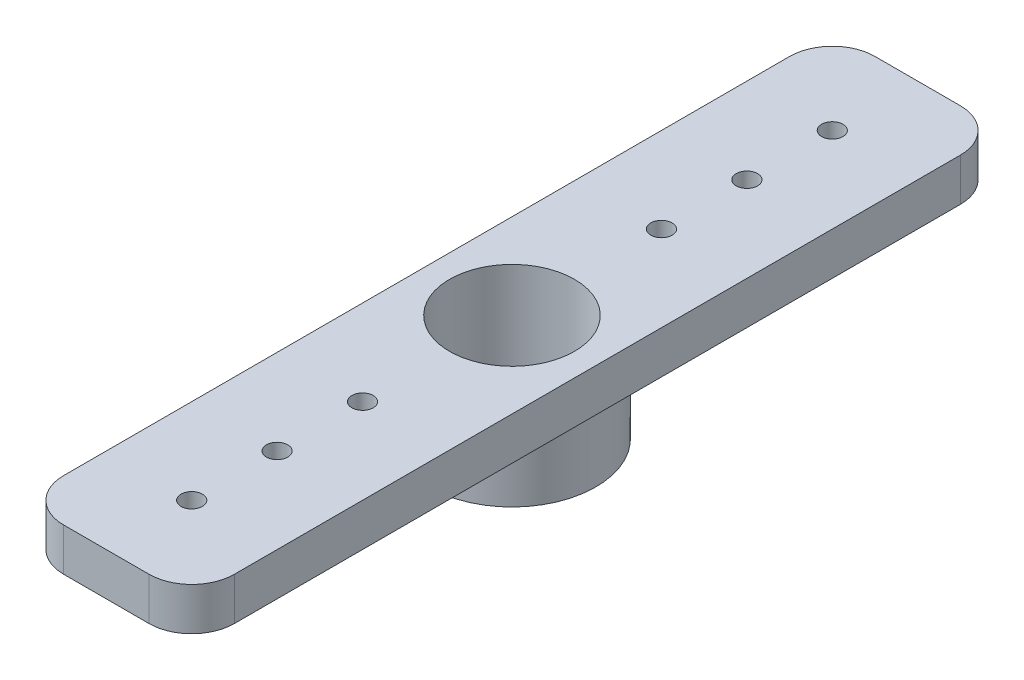
ISO-10303-21;
HEADER;
FILE_DESCRIPTION(('STEP AP214'),'2;1');
FILE_NAME('part.step','',(''),(''),'','','');
FILE_SCHEMA(('AUTOMOTIVE_DESIGN { 1 0 10303 214 1 1 1 1 }'));
ENDSEC;
DATA;
#1=APPLICATION_CONTEXT('core data for automotive mechanical design processes');
#2=APPLICATION_PROTOCOL_DEFINITION('international standard','automotive_design',2000,#1);
#3=PRODUCT_CONTEXT('',#1,'mechanical');
#4=PRODUCT('Part','Part','',(#3));
#5=PRODUCT_RELATED_PRODUCT_CATEGORY('part','',(#4));
#6=PRODUCT_DEFINITION_FORMATION('','',#4);
#7=PRODUCT_DEFINITION_CONTEXT('part definition',#1,'design');
#8=PRODUCT_DEFINITION('design','',#6,#7);
#9=PRODUCT_DEFINITION_SHAPE('','',#8);
#10=(LENGTH_UNIT() NAMED_UNIT(*) SI_UNIT(.MILLI.,.METRE.));
#11=(NAMED_UNIT(*) PLANE_ANGLE_UNIT() SI_UNIT($,.RADIAN.));
#12=(NAMED_UNIT(*) SI_UNIT($,.STERADIAN.) SOLID_ANGLE_UNIT());
#13=UNCERTAINTY_MEASURE_WITH_UNIT(LENGTH_MEASURE(1.E-05),#10,'distance_accuracy_value','');
#14=(GEOMETRIC_REPRESENTATION_CONTEXT(3) GLOBAL_UNCERTAINTY_ASSIGNED_CONTEXT((#13)) GLOBAL_UNIT_ASSIGNED_CONTEXT((#10,
#11,#12)) REPRESENTATION_CONTEXT('',''));
#15=CARTESIAN_POINT('',(0.,0.,0.));
#16=DIRECTION('',(0.,0.,1.));
#17=DIRECTION('',(1.,0.,0.));
#18=AXIS2_PLACEMENT_3D('',#15,#16,#17);
#19=CARTESIAN_POINT('',(0.,2.,0.));
#20=DIRECTION('',(1.,0.,0.));
#21=DIRECTION('',(0.,0.,-1.));
#22=AXIS2_PLACEMENT_3D('',#19,#20,#21);
#23=PLANE('',#22);
#24=DIRECTION('',(0.,0.,1.));
#25=VECTOR('',#24,1.);
#26=CARTESIAN_POINT('',(0.,2.,0.));
#27=LINE('',#26,#25);
#28=CARTESIAN_POINT('',(0.,2.,-36.));
#29=VERTEX_POINT('',#28);
#30=CARTESIAN_POINT('',(0.,2.,-2.));
#31=VERTEX_POINT('',#30);
#32=EDGE_CURVE('E125',#29,#31,#27,.T.);
#33=ORIENTED_EDGE('',*,*,#32,.F.);
#34=DIRECTION('',(0.,-1.,0.));
#35=VECTOR('',#34,1.);
#36=CARTESIAN_POINT('',(0.,2.,-36.));
#37=LINE('',#36,#35);
#38=CARTESIAN_POINT('',(0.,0.,-36.));
#39=VERTEX_POINT('',#38);
#40=EDGE_CURVE('E156',#29,#39,#37,.T.);
#41=ORIENTED_EDGE('',*,*,#40,.T.);
#42=DIRECTION('',(0.,0.,1.));
#43=VECTOR('',#42,1.);
#44=CARTESIAN_POINT('',(0.,0.,0.));
#45=LINE('',#44,#43);
#46=CARTESIAN_POINT('',(0.,0.,-2.));
#47=VERTEX_POINT('',#46);
#48=EDGE_CURVE('E162',#39,#47,#45,.T.);
#49=ORIENTED_EDGE('',*,*,#48,.T.);
#50=DIRECTION('',(0.,-1.,0.));
#51=VECTOR('',#50,1.);
#52=CARTESIAN_POINT('',(0.,2.,-2.));
#53=LINE('',#52,#51);
#54=EDGE_CURVE('E154',#47,#31,#53,.F.);
#55=ORIENTED_EDGE('',*,*,#54,.T.);
#56=EDGE_LOOP('',(#33,#41,#49,#55));
#57=FACE_BOUND('',#56,.T.);
#58=ADVANCED_FACE('F33',(#57),#23,.F.);
#59=CARTESIAN_POINT('',(0.,2.,0.));
#60=DIRECTION('',(0.,0.,-1.));
#61=DIRECTION('',(-1.,0.,0.));
#62=AXIS2_PLACEMENT_3D('',#59,#60,#61);
#63=PLANE('',#62);
#64=DIRECTION('',(1.,0.,0.));
#65=VECTOR('',#64,1.);
#66=CARTESIAN_POINT('',(0.,2.,0.));
#67=LINE('',#66,#65);
#68=CARTESIAN_POINT('',(2.,2.,0.));
#69=VERTEX_POINT('',#68);
#70=CARTESIAN_POINT('',(6.,2.,0.));
#71=VERTEX_POINT('',#70);
#72=EDGE_CURVE('E128',#69,#71,#67,.T.);
#73=ORIENTED_EDGE('',*,*,#72,.F.);
#74=DIRECTION('',(0.,-1.,0.));
#75=VECTOR('',#74,1.);
#76=CARTESIAN_POINT('',(2.,2.,0.));
#77=LINE('',#76,#75);
#78=CARTESIAN_POINT('',(2.,0.,0.));
#79=VERTEX_POINT('',#78);
#80=EDGE_CURVE('E11',#69,#79,#77,.T.);
#81=ORIENTED_EDGE('',*,*,#80,.T.);
#82=DIRECTION('',(1.,0.,0.));
#83=VECTOR('',#82,1.);
#84=CARTESIAN_POINT('',(0.,0.,0.));
#85=LINE('',#84,#83);
#86=CARTESIAN_POINT('',(6.,0.,0.));
#87=VERTEX_POINT('',#86);
#88=EDGE_CURVE('E130',#79,#87,#85,.T.);
#89=ORIENTED_EDGE('',*,*,#88,.T.);
#90=DIRECTION('',(0.,-1.,0.));
#91=VECTOR('',#90,1.);
#92=CARTESIAN_POINT('',(6.,2.,0.));
#93=LINE('',#92,#91);
#94=EDGE_CURVE('E41',#87,#71,#93,.F.);
#95=ORIENTED_EDGE('',*,*,#94,.T.);
#96=EDGE_LOOP('',(#73,#81,#89,#95));
#97=FACE_BOUND('',#96,.T.);
#98=ADVANCED_FACE('F245',(#97),#63,.F.);
#99=CARTESIAN_POINT('',(8.,2.,0.));
#100=DIRECTION('',(-1.,0.,0.));
#101=DIRECTION('',(0.,0.,1.));
#102=AXIS2_PLACEMENT_3D('',#99,#100,#101);
#103=PLANE('',#102);
#104=DIRECTION('',(0.,0.,-1.));
#105=VECTOR('',#104,1.);
#106=CARTESIAN_POINT('',(8.,0.,0.));
#107=LINE('',#106,#105);
#108=CARTESIAN_POINT('',(8.,0.,-2.));
#109=VERTEX_POINT('',#108);
#110=CARTESIAN_POINT('',(8.,0.,-36.));
#111=VERTEX_POINT('',#110);
#112=EDGE_CURVE('E126',#109,#111,#107,.T.);
#113=ORIENTED_EDGE('',*,*,#112,.T.);
#114=DIRECTION('',(0.,-1.,0.));
#115=VECTOR('',#114,1.);
#116=CARTESIAN_POINT('',(8.,2.,-36.));
#117=LINE('',#116,#115);
#118=CARTESIAN_POINT('',(8.,2.,-36.));
#119=VERTEX_POINT('',#118);
#120=EDGE_CURVE('E104',#111,#119,#117,.F.);
#121=ORIENTED_EDGE('',*,*,#120,.T.);
#122=DIRECTION('',(0.,0.,-1.));
#123=VECTOR('',#122,1.);
#124=CARTESIAN_POINT('',(8.,2.,0.));
#125=LINE('',#124,#123);
#126=CARTESIAN_POINT('',(8.,2.,-2.));
#127=VERTEX_POINT('',#126);
#128=EDGE_CURVE('E174',#127,#119,#125,.T.);
#129=ORIENTED_EDGE('',*,*,#128,.F.);
#130=DIRECTION('',(0.,-1.,0.));
#131=VECTOR('',#130,1.);
#132=CARTESIAN_POINT('',(8.,2.,-2.));
#133=LINE('',#132,#131);
#134=EDGE_CURVE('E109',#127,#109,#133,.T.);
#135=ORIENTED_EDGE('',*,*,#134,.T.);
#136=EDGE_LOOP('',(#113,#121,#129,#135));
#137=FACE_BOUND('',#136,.T.);
#138=ADVANCED_FACE('F250',(#137),#103,.F.);
#139=CARTESIAN_POINT('',(0.,2.,-38.));
#140=DIRECTION('',(0.,0.,1.));
#141=DIRECTION('',(1.,0.,0.));
#142=AXIS2_PLACEMENT_3D('',#139,#140,#141);
#143=PLANE('',#142);
#144=DIRECTION('',(-1.,0.,0.));
#145=VECTOR('',#144,1.);
#146=CARTESIAN_POINT('',(0.,2.,-38.));
#147=LINE('',#146,#145);
#148=CARTESIAN_POINT('',(6.,2.,-38.));
#149=VERTEX_POINT('',#148);
#150=CARTESIAN_POINT('',(2.,2.,-38.));
#151=VERTEX_POINT('',#150);
#152=EDGE_CURVE('E119',#149,#151,#147,.T.);
#153=ORIENTED_EDGE('',*,*,#152,.F.);
#154=DIRECTION('',(0.,-1.,0.));
#155=VECTOR('',#154,1.);
#156=CARTESIAN_POINT('',(6.,2.,-38.));
#157=LINE('',#156,#155);
#158=CARTESIAN_POINT('',(6.,0.,-38.));
#159=VERTEX_POINT('',#158);
#160=EDGE_CURVE('E103',#149,#159,#157,.T.);
#161=ORIENTED_EDGE('',*,*,#160,.T.);
#162=DIRECTION('',(-1.,0.,0.));
#163=VECTOR('',#162,1.);
#164=CARTESIAN_POINT('',(0.,0.,-38.));
#165=LINE('',#164,#163);
#166=CARTESIAN_POINT('',(2.,0.,-38.));
#167=VERTEX_POINT('',#166);
#168=EDGE_CURVE('E116',#159,#167,#165,.T.);
#169=ORIENTED_EDGE('',*,*,#168,.T.);
#170=DIRECTION('',(0.,-1.,0.));
#171=VECTOR('',#170,1.);
#172=CARTESIAN_POINT('',(2.,2.,-38.));
#173=LINE('',#172,#171);
#174=EDGE_CURVE('E121',#167,#151,#173,.F.);
#175=ORIENTED_EDGE('',*,*,#174,.T.);
#176=EDGE_LOOP('',(#153,#161,#169,#175));
#177=FACE_BOUND('',#176,.T.);
#178=ADVANCED_FACE('F115',(#177),#143,.F.);
#179=CARTESIAN_POINT('',(0.,2.,0.));
#180=DIRECTION('',(0.,-1.,0.));
#181=DIRECTION('',(0.,0.,-1.));
#182=AXIS2_PLACEMENT_3D('',#179,#180,#181);
#183=PLANE('',#182);
#184=CARTESIAN_POINT('',(4.,2.,-34.));
#185=DIRECTION('',(0.,-1.,0.));
#186=DIRECTION('',(0.,0.,-1.));
#187=AXIS2_PLACEMENT_3D('',#184,#185,#186);
#188=CIRCLE('',#187,0.500000000000001);
#189=CARTESIAN_POINT('',(4.,2.,-34.5));
#190=VERTEX_POINT('',#189);
#191=EDGE_CURVE('E138',#190,#190,#188,.T.);
#192=ORIENTED_EDGE('',*,*,#191,.T.);
#193=EDGE_LOOP('',(#192));
#194=FACE_BOUND('',#193,.T.);
#195=CARTESIAN_POINT('',(4.,2.,-30.));
#196=DIRECTION('',(0.,-1.,0.));
#197=DIRECTION('',(0.,0.,-1.));
#198=AXIS2_PLACEMENT_3D('',#195,#196,#197);
#199=CIRCLE('',#198,0.500000000000001);
#200=CARTESIAN_POINT('',(4.,2.,-30.5));
#201=VERTEX_POINT('',#200);
#202=EDGE_CURVE('E184',#201,#201,#199,.T.);
#203=ORIENTED_EDGE('',*,*,#202,.T.);
#204=EDGE_LOOP('',(#203));
#205=FACE_BOUND('',#204,.T.);
#206=CARTESIAN_POINT('',(4.,2.,-26.));
#207=DIRECTION('',(0.,-1.,0.));
#208=DIRECTION('',(0.,0.,-1.));
#209=AXIS2_PLACEMENT_3D('',#206,#207,#208);
#210=CIRCLE('',#209,0.500000000000001);
#211=CARTESIAN_POINT('',(4.,2.,-26.5));
#212=VERTEX_POINT('',#211);
#213=EDGE_CURVE('E187',#212,#212,#210,.T.);
#214=ORIENTED_EDGE('',*,*,#213,.T.);
#215=EDGE_LOOP('',(#214));
#216=FACE_BOUND('',#215,.T.);
#217=CARTESIAN_POINT('',(4.,2.,-12.));
#218=DIRECTION('',(0.,-1.,0.));
#219=DIRECTION('',(0.,0.,-1.));
#220=AXIS2_PLACEMENT_3D('',#217,#218,#219);
#221=CIRCLE('',#220,0.500000000000001);
#222=CARTESIAN_POINT('',(4.,2.,-12.5));
#223=VERTEX_POINT('',#222);
#224=EDGE_CURVE('E190',#223,#223,#221,.T.);
#225=ORIENTED_EDGE('',*,*,#224,.T.);
#226=EDGE_LOOP('',(#225));
#227=FACE_BOUND('',#226,.T.);
#228=CARTESIAN_POINT('',(4.,2.,-8.));
#229=DIRECTION('',(0.,-1.,0.));
#230=DIRECTION('',(0.,0.,-1.));
#231=AXIS2_PLACEMENT_3D('',#228,#229,#230);
#232=CIRCLE('',#231,0.500000000000001);
#233=CARTESIAN_POINT('',(4.,2.,-8.5));
#234=VERTEX_POINT('',#233);
#235=EDGE_CURVE('E193',#234,#234,#232,.T.);
#236=ORIENTED_EDGE('',*,*,#235,.T.);
#237=EDGE_LOOP('',(#236));
#238=FACE_BOUND('',#237,.T.);
#239=CARTESIAN_POINT('',(4.,2.,-4.));
#240=DIRECTION('',(0.,-1.,0.));
#241=DIRECTION('',(0.,0.,-1.));
#242=AXIS2_PLACEMENT_3D('',#239,#240,#241);
#243=CIRCLE('',#242,0.500000000000001);
#244=CARTESIAN_POINT('',(4.,2.,-4.5));
#245=VERTEX_POINT('',#244);
#246=EDGE_CURVE('E196',#245,#245,#243,.T.);
#247=ORIENTED_EDGE('',*,*,#246,.T.);
#248=EDGE_LOOP('',(#247));
#249=FACE_BOUND('',#248,.T.);
#250=CARTESIAN_POINT('',(4.,2.,-19.));
#251=DIRECTION('',(0.,-1.,0.));
#252=DIRECTION('',(0.,0.,-1.));
#253=AXIS2_PLACEMENT_3D('',#250,#251,#252);
#254=CIRCLE('',#253,2.925);
#255=CARTESIAN_POINT('',(4.,2.,-21.925));
#256=VERTEX_POINT('',#255);
#257=EDGE_CURVE('E134',#256,#256,#254,.T.);
#258=ORIENTED_EDGE('',*,*,#257,.T.);
#259=EDGE_LOOP('',(#258));
#260=FACE_BOUND('',#259,.T.);
#261=ORIENTED_EDGE('',*,*,#128,.T.);
#262=CARTESIAN_POINT('',(6.,2.,-36.));
#263=DIRECTION('',(0.,-1.,0.));
#264=DIRECTION('',(0.,0.,-1.));
#265=AXIS2_PLACEMENT_3D('',#262,#263,#264);
#266=CIRCLE('',#265,2.);
#267=EDGE_CURVE('E152',#119,#149,#266,.F.);
#268=ORIENTED_EDGE('',*,*,#267,.T.);
#269=ORIENTED_EDGE('',*,*,#152,.T.);
#270=CARTESIAN_POINT('',(2.,2.,-36.));
#271=DIRECTION('',(0.,-1.,0.));
#272=DIRECTION('',(0.,0.,-1.));
#273=AXIS2_PLACEMENT_3D('',#270,#271,#272);
#274=CIRCLE('',#273,2.);
#275=EDGE_CURVE('E150',#151,#29,#274,.F.);
#276=ORIENTED_EDGE('',*,*,#275,.T.);
#277=ORIENTED_EDGE('',*,*,#32,.T.);
#278=CARTESIAN_POINT('',(2.,2.,-2.));
#279=DIRECTION('',(0.,-1.,0.));
#280=DIRECTION('',(0.,0.,-1.));
#281=AXIS2_PLACEMENT_3D('',#278,#279,#280);
#282=CIRCLE('',#281,2.);
#283=EDGE_CURVE('E54',#31,#69,#282,.F.);
#284=ORIENTED_EDGE('',*,*,#283,.T.);
#285=ORIENTED_EDGE('',*,*,#72,.T.);
#286=CARTESIAN_POINT('',(6.,2.,-2.));
#287=DIRECTION('',(0.,-1.,0.));
#288=DIRECTION('',(0.,0.,-1.));
#289=AXIS2_PLACEMENT_3D('',#286,#287,#288);
#290=CIRCLE('',#289,2.);
#291=EDGE_CURVE('E147',#71,#127,#290,.F.);
#292=ORIENTED_EDGE('',*,*,#291,.T.);
#293=EDGE_LOOP('',(#261,#268,#269,#276,#277,#284,#285,#292));
#294=FACE_BOUND('',#293,.T.);
#295=ADVANCED_FACE('F224',(#194,#205,#216,#227,#238,#249,#260,#294),#183,.F.);
#296=CARTESIAN_POINT('',(0.,0.,0.));
#297=DIRECTION('',(0.,-1.,0.));
#298=DIRECTION('',(0.,0.,-1.));
#299=AXIS2_PLACEMENT_3D('',#296,#297,#298);
#300=PLANE('',#299);
#301=CARTESIAN_POINT('',(4.,0.,-34.));
#302=DIRECTION('',(0.,-1.,0.));
#303=DIRECTION('',(0.,0.,1.));
#304=AXIS2_PLACEMENT_3D('',#301,#302,#303);
#305=CIRCLE('',#304,0.500000000000001);
#306=CARTESIAN_POINT('',(4.,0.,-33.5));
#307=VERTEX_POINT('',#306);
#308=EDGE_CURVE('E200',#307,#307,#305,.T.);
#309=ORIENTED_EDGE('',*,*,#308,.F.);
#310=EDGE_LOOP('',(#309));
#311=FACE_BOUND('',#310,.T.);
#312=CARTESIAN_POINT('',(4.,0.,-30.));
#313=DIRECTION('',(0.,-1.,0.));
#314=DIRECTION('',(0.,0.,1.));
#315=AXIS2_PLACEMENT_3D('',#312,#313,#314);
#316=CIRCLE('',#315,0.500000000000001);
#317=CARTESIAN_POINT('',(4.,0.,-29.5));
#318=VERTEX_POINT('',#317);
#319=EDGE_CURVE('E203',#318,#318,#316,.T.);
#320=ORIENTED_EDGE('',*,*,#319,.F.);
#321=EDGE_LOOP('',(#320));
#322=FACE_BOUND('',#321,.T.);
#323=CARTESIAN_POINT('',(4.,0.,-26.));
#324=DIRECTION('',(0.,-1.,0.));
#325=DIRECTION('',(0.,0.,1.));
#326=AXIS2_PLACEMENT_3D('',#323,#324,#325);
#327=CIRCLE('',#326,0.500000000000001);
#328=CARTESIAN_POINT('',(4.,0.,-25.5));
#329=VERTEX_POINT('',#328);
#330=EDGE_CURVE('E206',#329,#329,#327,.T.);
#331=ORIENTED_EDGE('',*,*,#330,.F.);
#332=EDGE_LOOP('',(#331));
#333=FACE_BOUND('',#332,.T.);
#334=CARTESIAN_POINT('',(4.,0.,-12.));
#335=DIRECTION('',(0.,-1.,0.));
#336=DIRECTION('',(0.,0.,-1.));
#337=AXIS2_PLACEMENT_3D('',#334,#335,#336);
#338=CIRCLE('',#337,0.500000000000001);
#339=CARTESIAN_POINT('',(4.,0.,-12.5));
#340=VERTEX_POINT('',#339);
#341=EDGE_CURVE('E209',#340,#340,#338,.T.);
#342=ORIENTED_EDGE('',*,*,#341,.F.);
#343=EDGE_LOOP('',(#342));
#344=FACE_BOUND('',#343,.T.);
#345=CARTESIAN_POINT('',(4.,0.,-8.));
#346=DIRECTION('',(0.,-1.,0.));
#347=DIRECTION('',(0.,0.,-1.));
#348=AXIS2_PLACEMENT_3D('',#345,#346,#347);
#349=CIRCLE('',#348,0.500000000000001);
#350=CARTESIAN_POINT('',(4.,0.,-8.5));
#351=VERTEX_POINT('',#350);
#352=EDGE_CURVE('E212',#351,#351,#349,.T.);
#353=ORIENTED_EDGE('',*,*,#352,.F.);
#354=EDGE_LOOP('',(#353));
#355=FACE_BOUND('',#354,.T.);
#356=CARTESIAN_POINT('',(4.,0.,-4.));
#357=DIRECTION('',(0.,-1.,0.));
#358=DIRECTION('',(0.,0.,-1.));
#359=AXIS2_PLACEMENT_3D('',#356,#357,#358);
#360=CIRCLE('',#359,0.500000000000001);
#361=CARTESIAN_POINT('',(4.,0.,-4.5));
#362=VERTEX_POINT('',#361);
#363=EDGE_CURVE('E199',#362,#362,#360,.T.);
#364=ORIENTED_EDGE('',*,*,#363,.F.);
#365=EDGE_LOOP('',(#364));
#366=FACE_BOUND('',#365,.T.);
#367=CARTESIAN_POINT('',(4.,0.,-19.));
#368=DIRECTION('',(0.,-1.,0.));
#369=DIRECTION('',(0.,0.,-1.));
#370=AXIS2_PLACEMENT_3D('',#367,#368,#369);
#371=CIRCLE('',#370,3.925);
#372=CARTESIAN_POINT('',(4.,0.,-22.925));
#373=VERTEX_POINT('',#372);
#374=EDGE_CURVE('E170',#373,#373,#371,.T.);
#375=ORIENTED_EDGE('',*,*,#374,.F.);
#376=EDGE_LOOP('',(#375));
#377=FACE_BOUND('',#376,.T.);
#378=ORIENTED_EDGE('',*,*,#168,.F.);
#379=CARTESIAN_POINT('',(6.,0.,-36.));
#380=DIRECTION('',(0.,-1.,0.));
#381=DIRECTION('',(0.,0.,-1.));
#382=AXIS2_PLACEMENT_3D('',#379,#380,#381);
#383=CIRCLE('',#382,2.);
#384=EDGE_CURVE('E99',#159,#111,#383,.T.);
#385=ORIENTED_EDGE('',*,*,#384,.T.);
#386=ORIENTED_EDGE('',*,*,#112,.F.);
#387=CARTESIAN_POINT('',(6.,0.,-2.));
#388=DIRECTION('',(0.,-1.,0.));
#389=DIRECTION('',(0.,0.,-1.));
#390=AXIS2_PLACEMENT_3D('',#387,#388,#389);
#391=CIRCLE('',#390,2.);
#392=EDGE_CURVE('E120',#109,#87,#391,.T.);
#393=ORIENTED_EDGE('',*,*,#392,.T.);
#394=ORIENTED_EDGE('',*,*,#88,.F.);
#395=CARTESIAN_POINT('',(2.,0.,-2.));
#396=DIRECTION('',(0.,-1.,0.));
#397=DIRECTION('',(0.,0.,-1.));
#398=AXIS2_PLACEMENT_3D('',#395,#396,#397);
#399=CIRCLE('',#398,2.);
#400=EDGE_CURVE('E141',#79,#47,#399,.T.);
#401=ORIENTED_EDGE('',*,*,#400,.T.);
#402=ORIENTED_EDGE('',*,*,#48,.F.);
#403=CARTESIAN_POINT('',(2.,0.,-36.));
#404=DIRECTION('',(0.,-1.,0.));
#405=DIRECTION('',(0.,0.,-1.));
#406=AXIS2_PLACEMENT_3D('',#403,#404,#405);
#407=CIRCLE('',#406,2.);
#408=EDGE_CURVE('E110',#39,#167,#407,.T.);
#409=ORIENTED_EDGE('',*,*,#408,.T.);
#410=EDGE_LOOP('',(#378,#385,#386,#393,#394,#401,#402,#409));
#411=FACE_BOUND('',#410,.T.);
#412=ADVANCED_FACE('F123',(#311,#322,#333,#344,#355,#366,#377,#411),#300,.T.);
#413=CARTESIAN_POINT('',(4.,-3.,-19.));
#414=DIRECTION('',(0.,-1.,0.));
#415=DIRECTION('',(0.,0.,-1.));
#416=AXIS2_PLACEMENT_3D('',#413,#414,#415);
#417=PLANE('',#416);
#418=CARTESIAN_POINT('',(4.,-3.,-19.));
#419=DIRECTION('',(0.,-1.,0.));
#420=DIRECTION('',(0.,0.,-1.));
#421=AXIS2_PLACEMENT_3D('',#418,#419,#420);
#422=CIRCLE('',#421,3.925);
#423=CARTESIAN_POINT('',(4.,-3.,-22.925));
#424=VERTEX_POINT('',#423);
#425=EDGE_CURVE('E167',#424,#424,#422,.T.);
#426=ORIENTED_EDGE('',*,*,#425,.T.);
#427=EDGE_LOOP('',(#426));
#428=FACE_BOUND('',#427,.T.);
#429=CARTESIAN_POINT('',(4.,-3.,-19.));
#430=DIRECTION('',(0.,-1.,0.));
#431=DIRECTION('',(0.,0.,-1.));
#432=AXIS2_PLACEMENT_3D('',#429,#430,#431);
#433=CIRCLE('',#432,2.925);
#434=CARTESIAN_POINT('',(4.,-3.,-21.925));
#435=VERTEX_POINT('',#434);
#436=EDGE_CURVE('E137',#435,#435,#433,.T.);
#437=ORIENTED_EDGE('',*,*,#436,.F.);
#438=EDGE_LOOP('',(#437));
#439=FACE_BOUND('',#438,.T.);
#440=ADVANCED_FACE('F223',(#428,#439),#417,.T.);
#441=CARTESIAN_POINT('',(4.,-3.,-19.));
#442=DIRECTION('',(0.,1.,0.));
#443=DIRECTION('',(0.,0.,1.));
#444=AXIS2_PLACEMENT_3D('',#441,#442,#443);
#445=CYLINDRICAL_SURFACE('',#444,3.925);
#446=ORIENTED_EDGE('',*,*,#425,.F.);
#447=EDGE_LOOP('',(#446));
#448=FACE_BOUND('',#447,.T.);
#449=ORIENTED_EDGE('',*,*,#374,.T.);
#450=EDGE_LOOP('',(#449));
#451=FACE_BOUND('',#450,.T.);
#452=ADVANCED_FACE('F229',(#448,#451),#445,.T.);
#453=CARTESIAN_POINT('',(4.,-3.,-19.));
#454=DIRECTION('',(0.,1.,0.));
#455=DIRECTION('',(0.,0.,1.));
#456=AXIS2_PLACEMENT_3D('',#453,#454,#455);
#457=CYLINDRICAL_SURFACE('',#456,2.925);
#458=ORIENTED_EDGE('',*,*,#436,.T.);
#459=EDGE_LOOP('',(#458));
#460=FACE_BOUND('',#459,.T.);
#461=ORIENTED_EDGE('',*,*,#257,.F.);
#462=EDGE_LOOP('',(#461));
#463=FACE_BOUND('',#462,.T.);
#464=ADVANCED_FACE('F231',(#460,#463),#457,.F.);
#465=CARTESIAN_POINT('',(4.,3.,-4.));
#466=DIRECTION('',(0.,-1.,0.));
#467=DIRECTION('',(0.,0.,-1.));
#468=AXIS2_PLACEMENT_3D('',#465,#466,#467);
#469=CYLINDRICAL_SURFACE('',#468,0.500000000000001);
#470=ORIENTED_EDGE('',*,*,#363,.T.);
#471=EDGE_LOOP('',(#470));
#472=FACE_BOUND('',#471,.T.);
#473=ORIENTED_EDGE('',*,*,#246,.F.);
#474=EDGE_LOOP('',(#473));
#475=FACE_BOUND('',#474,.T.);
#476=ADVANCED_FACE('F218',(#472,#475),#469,.F.);
#477=CARTESIAN_POINT('',(4.,3.,-8.));
#478=DIRECTION('',(0.,-1.,0.));
#479=DIRECTION('',(0.,0.,-1.));
#480=AXIS2_PLACEMENT_3D('',#477,#478,#479);
#481=CYLINDRICAL_SURFACE('',#480,0.500000000000001);
#482=ORIENTED_EDGE('',*,*,#352,.T.);
#483=EDGE_LOOP('',(#482));
#484=FACE_BOUND('',#483,.T.);
#485=ORIENTED_EDGE('',*,*,#235,.F.);
#486=EDGE_LOOP('',(#485));
#487=FACE_BOUND('',#486,.T.);
#488=ADVANCED_FACE('F352',(#484,#487),#481,.F.);
#489=CARTESIAN_POINT('',(4.,3.,-12.));
#490=DIRECTION('',(0.,-1.,0.));
#491=DIRECTION('',(0.,0.,-1.));
#492=AXIS2_PLACEMENT_3D('',#489,#490,#491);
#493=CYLINDRICAL_SURFACE('',#492,0.500000000000001);
#494=ORIENTED_EDGE('',*,*,#341,.T.);
#495=EDGE_LOOP('',(#494));
#496=FACE_BOUND('',#495,.T.);
#497=ORIENTED_EDGE('',*,*,#224,.F.);
#498=EDGE_LOOP('',(#497));
#499=FACE_BOUND('',#498,.T.);
#500=ADVANCED_FACE('F344',(#496,#499),#493,.F.);
#501=CARTESIAN_POINT('',(4.,3.,-26.));
#502=DIRECTION('',(0.,-1.,0.));
#503=DIRECTION('',(0.,0.,-1.));
#504=AXIS2_PLACEMENT_3D('',#501,#502,#503);
#505=CYLINDRICAL_SURFACE('',#504,0.500000000000001);
#506=ORIENTED_EDGE('',*,*,#330,.T.);
#507=EDGE_LOOP('',(#506));
#508=FACE_BOUND('',#507,.T.);
#509=ORIENTED_EDGE('',*,*,#213,.F.);
#510=EDGE_LOOP('',(#509));
#511=FACE_BOUND('',#510,.T.);
#512=ADVANCED_FACE('F336',(#508,#511),#505,.F.);
#513=CARTESIAN_POINT('',(4.,3.,-30.));
#514=DIRECTION('',(0.,-1.,0.));
#515=DIRECTION('',(0.,0.,-1.));
#516=AXIS2_PLACEMENT_3D('',#513,#514,#515);
#517=CYLINDRICAL_SURFACE('',#516,0.500000000000001);
#518=ORIENTED_EDGE('',*,*,#319,.T.);
#519=EDGE_LOOP('',(#518));
#520=FACE_BOUND('',#519,.T.);
#521=ORIENTED_EDGE('',*,*,#202,.F.);
#522=EDGE_LOOP('',(#521));
#523=FACE_BOUND('',#522,.T.);
#524=ADVANCED_FACE('F329',(#520,#523),#517,.F.);
#525=CARTESIAN_POINT('',(4.,3.,-34.));
#526=DIRECTION('',(0.,-1.,0.));
#527=DIRECTION('',(0.,0.,-1.));
#528=AXIS2_PLACEMENT_3D('',#525,#526,#527);
#529=CYLINDRICAL_SURFACE('',#528,0.500000000000001);
#530=ORIENTED_EDGE('',*,*,#308,.T.);
#531=EDGE_LOOP('',(#530));
#532=FACE_BOUND('',#531,.T.);
#533=ORIENTED_EDGE('',*,*,#191,.F.);
#534=EDGE_LOOP('',(#533));
#535=FACE_BOUND('',#534,.T.);
#536=ADVANCED_FACE('F257',(#532,#535),#529,.F.);
#537=CARTESIAN_POINT('',(6.,2.,-36.));
#538=DIRECTION('',(0.,-1.,0.));
#539=DIRECTION('',(0.,0.,-1.));
#540=AXIS2_PLACEMENT_3D('',#537,#538,#539);
#541=CYLINDRICAL_SURFACE('',#540,2.);
#542=ORIENTED_EDGE('',*,*,#267,.F.);
#543=ORIENTED_EDGE('',*,*,#120,.F.);
#544=ORIENTED_EDGE('',*,*,#384,.F.);
#545=ORIENTED_EDGE('',*,*,#160,.F.);
#546=EDGE_LOOP('',(#542,#543,#544,#545));
#547=FACE_BOUND('',#546,.T.);
#548=ADVANCED_FACE('F102',(#547),#541,.T.);
#549=CARTESIAN_POINT('',(2.,2.,-36.));
#550=DIRECTION('',(0.,-1.,0.));
#551=DIRECTION('',(0.,0.,-1.));
#552=AXIS2_PLACEMENT_3D('',#549,#550,#551);
#553=CYLINDRICAL_SURFACE('',#552,2.);
#554=ORIENTED_EDGE('',*,*,#275,.F.);
#555=ORIENTED_EDGE('',*,*,#174,.F.);
#556=ORIENTED_EDGE('',*,*,#408,.F.);
#557=ORIENTED_EDGE('',*,*,#40,.F.);
#558=EDGE_LOOP('',(#554,#555,#556,#557));
#559=FACE_BOUND('',#558,.T.);
#560=ADVANCED_FACE('F256',(#559),#553,.T.);
#561=CARTESIAN_POINT('',(2.,2.,-2.));
#562=DIRECTION('',(0.,-1.,0.));
#563=DIRECTION('',(0.,0.,-1.));
#564=AXIS2_PLACEMENT_3D('',#561,#562,#563);
#565=CYLINDRICAL_SURFACE('',#564,2.);
#566=ORIENTED_EDGE('',*,*,#283,.F.);
#567=ORIENTED_EDGE('',*,*,#54,.F.);
#568=ORIENTED_EDGE('',*,*,#400,.F.);
#569=ORIENTED_EDGE('',*,*,#80,.F.);
#570=EDGE_LOOP('',(#566,#567,#568,#569));
#571=FACE_BOUND('',#570,.T.);
#572=ADVANCED_FACE('F259',(#571),#565,.T.);
#573=CARTESIAN_POINT('',(6.,2.,-2.));
#574=DIRECTION('',(0.,-1.,0.));
#575=DIRECTION('',(0.,0.,-1.));
#576=AXIS2_PLACEMENT_3D('',#573,#574,#575);
#577=CYLINDRICAL_SURFACE('',#576,2.);
#578=ORIENTED_EDGE('',*,*,#291,.F.);
#579=ORIENTED_EDGE('',*,*,#94,.F.);
#580=ORIENTED_EDGE('',*,*,#392,.F.);
#581=ORIENTED_EDGE('',*,*,#134,.F.);
#582=EDGE_LOOP('',(#578,#579,#580,#581));
#583=FACE_BOUND('',#582,.T.);
#584=ADVANCED_FACE('F35',(#583),#577,.T.);
#585=CLOSED_SHELL('',(#58,#98,#138,#178,#295,#412,#440,#452,#464,#476,#488,#500,#512,#524,#536,
#548,#560,#572,#584));
#586=MANIFOLD_SOLID_BREP('B2',#585);
#587=ADVANCED_BREP_SHAPE_REPRESENTATION('',(#18,#586),#14);
#588=SHAPE_DEFINITION_REPRESENTATION(#9,#587);
ENDSEC;
END-ISO-10303-21;
